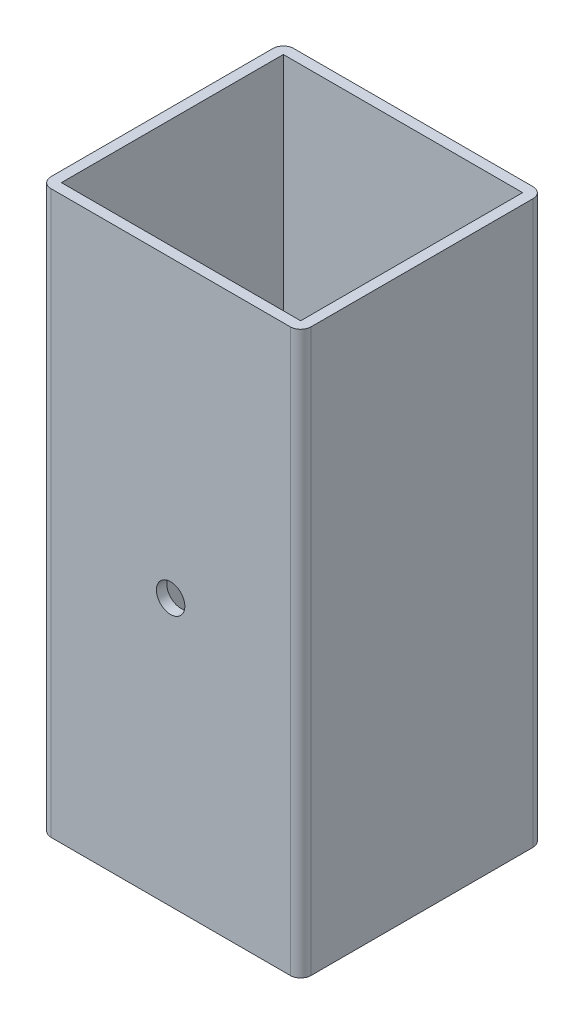
ISO-10303-21;
HEADER;
FILE_DESCRIPTION(('STEP AP214'),'2;1');
FILE_NAME('part.step','',(''),(''),'','','');
FILE_SCHEMA(('AUTOMOTIVE_DESIGN { 1 0 10303 214 1 1 1 1 }'));
ENDSEC;
DATA;
#1=APPLICATION_CONTEXT('core data for automotive mechanical design processes');
#2=APPLICATION_PROTOCOL_DEFINITION('international standard','automotive_design',2000,#1);
#3=PRODUCT_CONTEXT('',#1,'mechanical');
#4=PRODUCT('Part','Part','',(#3));
#5=PRODUCT_RELATED_PRODUCT_CATEGORY('part','',(#4));
#6=PRODUCT_DEFINITION_FORMATION('','',#4);
#7=PRODUCT_DEFINITION_CONTEXT('part definition',#1,'design');
#8=PRODUCT_DEFINITION('design','',#6,#7);
#9=PRODUCT_DEFINITION_SHAPE('','',#8);
#10=(LENGTH_UNIT() NAMED_UNIT(*) SI_UNIT(.MILLI.,.METRE.));
#11=(NAMED_UNIT(*) PLANE_ANGLE_UNIT() SI_UNIT($,.RADIAN.));
#12=(NAMED_UNIT(*) SI_UNIT($,.STERADIAN.) SOLID_ANGLE_UNIT());
#13=UNCERTAINTY_MEASURE_WITH_UNIT(LENGTH_MEASURE(1.E-05),#10,'distance_accuracy_value','');
#14=(GEOMETRIC_REPRESENTATION_CONTEXT(3) GLOBAL_UNCERTAINTY_ASSIGNED_CONTEXT((#13)) GLOBAL_UNIT_ASSIGNED_CONTEXT((#10,
#11,#12)) REPRESENTATION_CONTEXT('',''));
#15=CARTESIAN_POINT('',(0.,0.,0.));
#16=DIRECTION('',(0.,0.,1.));
#17=DIRECTION('',(1.,0.,0.));
#18=AXIS2_PLACEMENT_3D('',#15,#16,#17);
#19=CARTESIAN_POINT('',(75.,162.,70.));
#20=DIRECTION('',(0.,-1.,0.));
#21=DIRECTION('',(0.,0.,-1.));
#22=AXIS2_PLACEMENT_3D('',#19,#20,#21);
#23=PLANE('',#22);
#24=DIRECTION('',(-1.,0.,0.));
#25=VECTOR('',#24,1.);
#26=CARTESIAN_POINT('',(75.,162.,0.));
#27=LINE('',#26,#25);
#28=CARTESIAN_POINT('',(72.,162.,0.));
#29=VERTEX_POINT('',#28);
#30=CARTESIAN_POINT('',(3.,162.,0.));
#31=VERTEX_POINT('',#30);
#32=EDGE_CURVE('E172',#29,#31,#27,.T.);
#33=ORIENTED_EDGE('',*,*,#32,.T.);
#34=CARTESIAN_POINT('',(3.,162.,3.));
#35=DIRECTION('',(0.,-1.,0.));
#36=DIRECTION('',(0.,0.,-1.));
#37=AXIS2_PLACEMENT_3D('',#34,#35,#36);
#38=CIRCLE('',#37,3.);
#39=CARTESIAN_POINT('',(0.,162.,3.));
#40=VERTEX_POINT('',#39);
#41=EDGE_CURVE('E213',#31,#40,#38,.F.);
#42=ORIENTED_EDGE('',*,*,#41,.T.);
#43=DIRECTION('',(0.,0.,-1.));
#44=VECTOR('',#43,1.);
#45=CARTESIAN_POINT('',(0.,162.,70.));
#46=LINE('',#45,#44);
#47=CARTESIAN_POINT('',(0.,162.,67.));
#48=VERTEX_POINT('',#47);
#49=EDGE_CURVE('E175',#48,#40,#46,.T.);
#50=ORIENTED_EDGE('',*,*,#49,.F.);
#51=CARTESIAN_POINT('',(3.,162.,67.));
#52=DIRECTION('',(0.,-1.,0.));
#53=DIRECTION('',(0.,0.,-1.));
#54=AXIS2_PLACEMENT_3D('',#51,#52,#53);
#55=CIRCLE('',#54,3.);
#56=CARTESIAN_POINT('',(3.,162.,70.));
#57=VERTEX_POINT('',#56);
#58=EDGE_CURVE('E210',#48,#57,#55,.F.);
#59=ORIENTED_EDGE('',*,*,#58,.T.);
#60=DIRECTION('',(-1.,0.,0.));
#61=VECTOR('',#60,1.);
#62=CARTESIAN_POINT('',(75.,162.,70.));
#63=LINE('',#62,#61);
#64=CARTESIAN_POINT('',(72.,162.,70.));
#65=VERTEX_POINT('',#64);
#66=EDGE_CURVE('E171',#65,#57,#63,.T.);
#67=ORIENTED_EDGE('',*,*,#66,.F.);
#68=CARTESIAN_POINT('',(72.,162.,67.));
#69=DIRECTION('',(0.,-1.,0.));
#70=DIRECTION('',(0.,0.,-1.));
#71=AXIS2_PLACEMENT_3D('',#68,#69,#70);
#72=CIRCLE('',#71,3.);
#73=CARTESIAN_POINT('',(75.,162.,67.));
#74=VERTEX_POINT('',#73);
#75=EDGE_CURVE('E208',#65,#74,#72,.F.);
#76=ORIENTED_EDGE('',*,*,#75,.T.);
#77=DIRECTION('',(0.,0.,-1.));
#78=VECTOR('',#77,1.);
#79=CARTESIAN_POINT('',(75.,162.,70.));
#80=LINE('',#79,#78);
#81=CARTESIAN_POINT('',(75.,162.,3.));
#82=VERTEX_POINT('',#81);
#83=EDGE_CURVE('E182',#74,#82,#80,.T.);
#84=ORIENTED_EDGE('',*,*,#83,.T.);
#85=CARTESIAN_POINT('',(72.,162.,3.));
#86=DIRECTION('',(0.,-1.,0.));
#87=DIRECTION('',(0.,0.,-1.));
#88=AXIS2_PLACEMENT_3D('',#85,#86,#87);
#89=CIRCLE('',#88,3.);
#90=EDGE_CURVE('E63',#82,#29,#89,.F.);
#91=ORIENTED_EDGE('',*,*,#90,.T.);
#92=EDGE_LOOP('',(#33,#42,#50,#59,#67,#76,#84,#91));
#93=FACE_BOUND('',#92,.T.);
#94=DIRECTION('',(-1.,0.,0.));
#95=VECTOR('',#94,1.);
#96=CARTESIAN_POINT('',(75.,162.,3.));
#97=LINE('',#96,#95);
#98=CARTESIAN_POINT('',(72.,162.,3.));
#99=VERTEX_POINT('',#98);
#100=CARTESIAN_POINT('',(3.,162.,3.));
#101=VERTEX_POINT('',#100);
#102=EDGE_CURVE('E151',#99,#101,#97,.T.);
#103=ORIENTED_EDGE('',*,*,#102,.F.);
#104=DIRECTION('',(0.,0.,-1.));
#105=VECTOR('',#104,1.);
#106=CARTESIAN_POINT('',(72.,162.,70.));
#107=LINE('',#106,#105);
#108=CARTESIAN_POINT('',(72.,162.,67.));
#109=VERTEX_POINT('',#108);
#110=EDGE_CURVE('E164',#109,#99,#107,.T.);
#111=ORIENTED_EDGE('',*,*,#110,.F.);
#112=DIRECTION('',(-1.,0.,0.));
#113=VECTOR('',#112,1.);
#114=CARTESIAN_POINT('',(75.,162.,67.));
#115=LINE('',#114,#113);
#116=CARTESIAN_POINT('',(3.,162.,67.));
#117=VERTEX_POINT('',#116);
#118=EDGE_CURVE('E55',#109,#117,#115,.T.);
#119=ORIENTED_EDGE('',*,*,#118,.T.);
#120=DIRECTION('',(0.,0.,-1.));
#121=VECTOR('',#120,1.);
#122=CARTESIAN_POINT('',(3.,162.,70.));
#123=LINE('',#122,#121);
#124=EDGE_CURVE('E145',#117,#101,#123,.T.);
#125=ORIENTED_EDGE('',*,*,#124,.T.);
#126=EDGE_LOOP('',(#103,#111,#119,#125));
#127=FACE_BOUND('',#126,.T.);
#128=ADVANCED_FACE('F39',(#93,#127),#23,.F.);
#129=CARTESIAN_POINT('',(0.,162.,70.));
#130=DIRECTION('',(1.,0.,0.));
#131=DIRECTION('',(0.,0.,-1.));
#132=AXIS2_PLACEMENT_3D('',#129,#130,#131);
#133=PLANE('',#132);
#134=ORIENTED_EDGE('',*,*,#49,.T.);
#135=DIRECTION('',(0.,-1.,0.));
#136=VECTOR('',#135,1.);
#137=CARTESIAN_POINT('',(0.,162.,3.));
#138=LINE('',#137,#136);
#139=CARTESIAN_POINT('',(0.,0.,3.));
#140=VERTEX_POINT('',#139);
#141=EDGE_CURVE('E193',#40,#140,#138,.T.);
#142=ORIENTED_EDGE('',*,*,#141,.T.);
#143=DIRECTION('',(0.,0.,-1.));
#144=VECTOR('',#143,1.);
#145=CARTESIAN_POINT('',(0.,0.,70.));
#146=LINE('',#145,#144);
#147=CARTESIAN_POINT('',(0.,0.,67.));
#148=VERTEX_POINT('',#147);
#149=EDGE_CURVE('E188',#148,#140,#146,.T.);
#150=ORIENTED_EDGE('',*,*,#149,.F.);
#151=DIRECTION('',(0.,-1.,0.));
#152=VECTOR('',#151,1.);
#153=CARTESIAN_POINT('',(0.,162.,67.));
#154=LINE('',#153,#152);
#155=EDGE_CURVE('E191',#148,#48,#154,.F.);
#156=ORIENTED_EDGE('',*,*,#155,.T.);
#157=EDGE_LOOP('',(#134,#142,#150,#156));
#158=FACE_BOUND('',#157,.T.);
#159=ADVANCED_FACE('F255',(#158),#133,.F.);
#160=CARTESIAN_POINT('',(0.,0.,70.));
#161=DIRECTION('',(0.,1.,0.));
#162=DIRECTION('',(0.,0.,1.));
#163=AXIS2_PLACEMENT_3D('',#160,#161,#162);
#164=PLANE('',#163);
#165=ORIENTED_EDGE('',*,*,#149,.T.);
#166=CARTESIAN_POINT('',(3.,0.,3.));
#167=DIRECTION('',(0.,1.,0.));
#168=DIRECTION('',(0.,0.,1.));
#169=AXIS2_PLACEMENT_3D('',#166,#167,#168);
#170=CIRCLE('',#169,3.);
#171=CARTESIAN_POINT('',(3.,0.,0.));
#172=VERTEX_POINT('',#171);
#173=EDGE_CURVE('E202',#140,#172,#170,.F.);
#174=ORIENTED_EDGE('',*,*,#173,.T.);
#175=DIRECTION('',(1.,0.,0.));
#176=VECTOR('',#175,1.);
#177=CARTESIAN_POINT('',(0.,0.,0.));
#178=LINE('',#177,#176);
#179=CARTESIAN_POINT('',(72.,0.,0.));
#180=VERTEX_POINT('',#179);
#181=EDGE_CURVE('E163',#172,#180,#178,.T.);
#182=ORIENTED_EDGE('',*,*,#181,.T.);
#183=CARTESIAN_POINT('',(72.,0.,3.));
#184=DIRECTION('',(0.,1.,0.));
#185=DIRECTION('',(0.,0.,1.));
#186=AXIS2_PLACEMENT_3D('',#183,#184,#185);
#187=CIRCLE('',#186,3.);
#188=CARTESIAN_POINT('',(75.,0.,3.));
#189=VERTEX_POINT('',#188);
#190=EDGE_CURVE('E200',#180,#189,#187,.F.);
#191=ORIENTED_EDGE('',*,*,#190,.T.);
#192=DIRECTION('',(0.,0.,-1.));
#193=VECTOR('',#192,1.);
#194=CARTESIAN_POINT('',(75.,0.,70.));
#195=LINE('',#194,#193);
#196=CARTESIAN_POINT('',(75.,0.,67.));
#197=VERTEX_POINT('',#196);
#198=EDGE_CURVE('E185',#197,#189,#195,.T.);
#199=ORIENTED_EDGE('',*,*,#198,.F.);
#200=CARTESIAN_POINT('',(72.,0.,67.));
#201=DIRECTION('',(0.,1.,0.));
#202=DIRECTION('',(0.,0.,1.));
#203=AXIS2_PLACEMENT_3D('',#200,#201,#202);
#204=CIRCLE('',#203,3.);
#205=CARTESIAN_POINT('',(72.,0.,70.));
#206=VERTEX_POINT('',#205);
#207=EDGE_CURVE('E196',#197,#206,#204,.F.);
#208=ORIENTED_EDGE('',*,*,#207,.T.);
#209=DIRECTION('',(1.,0.,0.));
#210=VECTOR('',#209,1.);
#211=CARTESIAN_POINT('',(0.,0.,70.));
#212=LINE('',#211,#210);
#213=CARTESIAN_POINT('',(3.,0.,70.));
#214=VERTEX_POINT('',#213);
#215=EDGE_CURVE('E168',#214,#206,#212,.T.);
#216=ORIENTED_EDGE('',*,*,#215,.F.);
#217=CARTESIAN_POINT('',(3.,0.,67.));
#218=DIRECTION('',(0.,1.,0.));
#219=DIRECTION('',(0.,0.,1.));
#220=AXIS2_PLACEMENT_3D('',#217,#218,#219);
#221=CIRCLE('',#220,3.);
#222=EDGE_CURVE('E198',#214,#148,#221,.F.);
#223=ORIENTED_EDGE('',*,*,#222,.T.);
#224=EDGE_LOOP('',(#165,#174,#182,#191,#199,#208,#216,#223));
#225=FACE_BOUND('',#224,.T.);
#226=ADVANCED_FACE('F237',(#225),#164,.F.);
#227=CARTESIAN_POINT('',(75.,0.,70.));
#228=DIRECTION('',(-1.,0.,0.));
#229=DIRECTION('',(0.,0.,1.));
#230=AXIS2_PLACEMENT_3D('',#227,#228,#229);
#231=PLANE('',#230);
#232=ORIENTED_EDGE('',*,*,#198,.T.);
#233=DIRECTION('',(0.,1.,0.));
#234=VECTOR('',#233,1.);
#235=CARTESIAN_POINT('',(75.,0.,3.));
#236=LINE('',#235,#234);
#237=EDGE_CURVE('E217',#189,#82,#236,.T.);
#238=ORIENTED_EDGE('',*,*,#237,.T.);
#239=ORIENTED_EDGE('',*,*,#83,.F.);
#240=DIRECTION('',(0.,1.,0.));
#241=VECTOR('',#240,1.);
#242=CARTESIAN_POINT('',(75.,0.,67.));
#243=LINE('',#242,#241);
#244=EDGE_CURVE('E215',#74,#197,#243,.F.);
#245=ORIENTED_EDGE('',*,*,#244,.T.);
#246=EDGE_LOOP('',(#232,#238,#239,#245));
#247=FACE_BOUND('',#246,.T.);
#248=ADVANCED_FACE('F242',(#247),#231,.F.);
#249=CARTESIAN_POINT('',(0.,0.,70.));
#250=DIRECTION('',(0.,0.,1.));
#251=DIRECTION('',(1.,0.,0.));
#252=AXIS2_PLACEMENT_3D('',#249,#250,#251);
#253=PLANE('',#252);
#254=CARTESIAN_POINT('',(37.5,77.,70.));
#255=DIRECTION('',(0.,0.,-1.));
#256=DIRECTION('',(-1.,0.,0.));
#257=AXIS2_PLACEMENT_3D('',#254,#255,#256);
#258=CIRCLE('',#257,4.1);
#259=CARTESIAN_POINT('',(33.4,77.,70.));
#260=VERTEX_POINT('',#259);
#261=EDGE_CURVE('E404',#260,#260,#258,.T.);
#262=ORIENTED_EDGE('',*,*,#261,.T.);
#263=EDGE_LOOP('',(#262));
#264=FACE_BOUND('',#263,.T.);
#265=ORIENTED_EDGE('',*,*,#66,.T.);
#266=DIRECTION('',(0.,-1.,0.));
#267=VECTOR('',#266,1.);
#268=CARTESIAN_POINT('',(3.,0.,70.));
#269=LINE('',#268,#267);
#270=EDGE_CURVE('E11',#57,#214,#269,.T.);
#271=ORIENTED_EDGE('',*,*,#270,.T.);
#272=ORIENTED_EDGE('',*,*,#215,.T.);
#273=DIRECTION('',(0.,1.,0.));
#274=VECTOR('',#273,1.);
#275=CARTESIAN_POINT('',(72.,162.,70.));
#276=LINE('',#275,#274);
#277=EDGE_CURVE('E48',#206,#65,#276,.T.);
#278=ORIENTED_EDGE('',*,*,#277,.T.);
#279=EDGE_LOOP('',(#265,#271,#272,#278));
#280=FACE_BOUND('',#279,.T.);
#281=ADVANCED_FACE('F223',(#264,#280),#253,.T.);
#282=CARTESIAN_POINT('',(0.,0.,0.));
#283=DIRECTION('',(0.,0.,1.));
#284=DIRECTION('',(1.,0.,0.));
#285=AXIS2_PLACEMENT_3D('',#282,#283,#284);
#286=PLANE('',#285);
#287=CARTESIAN_POINT('',(37.5,77.,0.));
#288=DIRECTION('',(0.,0.,-1.));
#289=DIRECTION('',(-1.,0.,0.));
#290=AXIS2_PLACEMENT_3D('',#287,#288,#289);
#291=CIRCLE('',#290,4.1);
#292=CARTESIAN_POINT('',(33.4,77.,0.));
#293=VERTEX_POINT('',#292);
#294=EDGE_CURVE('E412',#293,#293,#291,.T.);
#295=ORIENTED_EDGE('',*,*,#294,.F.);
#296=EDGE_LOOP('',(#295));
#297=FACE_BOUND('',#296,.T.);
#298=ORIENTED_EDGE('',*,*,#181,.F.);
#299=DIRECTION('',(0.,-1.,0.));
#300=VECTOR('',#299,1.);
#301=CARTESIAN_POINT('',(3.,0.,0.));
#302=LINE('',#301,#300);
#303=EDGE_CURVE('E206',#172,#31,#302,.F.);
#304=ORIENTED_EDGE('',*,*,#303,.T.);
#305=ORIENTED_EDGE('',*,*,#32,.F.);
#306=DIRECTION('',(0.,1.,0.));
#307=VECTOR('',#306,1.);
#308=CARTESIAN_POINT('',(72.,0.,0.));
#309=LINE('',#308,#307);
#310=EDGE_CURVE('E204',#29,#180,#309,.F.);
#311=ORIENTED_EDGE('',*,*,#310,.T.);
#312=EDGE_LOOP('',(#298,#304,#305,#311));
#313=FACE_BOUND('',#312,.T.);
#314=ADVANCED_FACE('F247',(#297,#313),#286,.F.);
#315=CARTESIAN_POINT('',(3.,162.,3.));
#316=DIRECTION('',(0.,-1.,0.));
#317=DIRECTION('',(0.,0.,-1.));
#318=AXIS2_PLACEMENT_3D('',#315,#316,#317);
#319=CYLINDRICAL_SURFACE('',#318,3.);
#320=ORIENTED_EDGE('',*,*,#41,.F.);
#321=ORIENTED_EDGE('',*,*,#303,.F.);
#322=ORIENTED_EDGE('',*,*,#173,.F.);
#323=ORIENTED_EDGE('',*,*,#141,.F.);
#324=EDGE_LOOP('',(#320,#321,#322,#323));
#325=FACE_BOUND('',#324,.T.);
#326=ADVANCED_FACE('F252',(#325),#319,.T.);
#327=CARTESIAN_POINT('',(72.,0.,3.));
#328=DIRECTION('',(0.,1.,0.));
#329=DIRECTION('',(0.,0.,1.));
#330=AXIS2_PLACEMENT_3D('',#327,#328,#329);
#331=CYLINDRICAL_SURFACE('',#330,3.);
#332=ORIENTED_EDGE('',*,*,#190,.F.);
#333=ORIENTED_EDGE('',*,*,#310,.F.);
#334=ORIENTED_EDGE('',*,*,#90,.F.);
#335=ORIENTED_EDGE('',*,*,#237,.F.);
#336=EDGE_LOOP('',(#332,#333,#334,#335));
#337=FACE_BOUND('',#336,.T.);
#338=ADVANCED_FACE('F250',(#337),#331,.T.);
#339=CARTESIAN_POINT('',(3.,0.,67.));
#340=DIRECTION('',(0.,1.,0.));
#341=DIRECTION('',(0.,0.,1.));
#342=AXIS2_PLACEMENT_3D('',#339,#340,#341);
#343=CYLINDRICAL_SURFACE('',#342,3.);
#344=ORIENTED_EDGE('',*,*,#58,.F.);
#345=ORIENTED_EDGE('',*,*,#155,.F.);
#346=ORIENTED_EDGE('',*,*,#222,.F.);
#347=ORIENTED_EDGE('',*,*,#270,.F.);
#348=EDGE_LOOP('',(#344,#345,#346,#347));
#349=FACE_BOUND('',#348,.T.);
#350=ADVANCED_FACE('F235',(#349),#343,.T.);
#351=CARTESIAN_POINT('',(72.,0.,67.));
#352=DIRECTION('',(0.,-1.,0.));
#353=DIRECTION('',(0.,0.,-1.));
#354=AXIS2_PLACEMENT_3D('',#351,#352,#353);
#355=CYLINDRICAL_SURFACE('',#354,3.);
#356=ORIENTED_EDGE('',*,*,#207,.F.);
#357=ORIENTED_EDGE('',*,*,#244,.F.);
#358=ORIENTED_EDGE('',*,*,#75,.F.);
#359=ORIENTED_EDGE('',*,*,#277,.F.);
#360=EDGE_LOOP('',(#356,#357,#358,#359));
#361=FACE_BOUND('',#360,.T.);
#362=ADVANCED_FACE('F41',(#361),#355,.T.);
#363=CARTESIAN_POINT('',(3.,162.,70.));
#364=DIRECTION('',(1.,0.,0.));
#365=DIRECTION('',(0.,0.,-1.));
#366=AXIS2_PLACEMENT_3D('',#363,#364,#365);
#367=PLANE('',#366);
#368=ORIENTED_EDGE('',*,*,#124,.F.);
#369=DIRECTION('',(0.,1.,0.));
#370=VECTOR('',#369,1.);
#371=CARTESIAN_POINT('',(3.,0.,67.));
#372=LINE('',#371,#370);
#373=CARTESIAN_POINT('',(3.,3.,67.));
#374=VERTEX_POINT('',#373);
#375=EDGE_CURVE('E139',#374,#117,#372,.T.);
#376=ORIENTED_EDGE('',*,*,#375,.F.);
#377=DIRECTION('',(0.,0.,-1.));
#378=VECTOR('',#377,1.);
#379=CARTESIAN_POINT('',(3.,3.,70.));
#380=LINE('',#379,#378);
#381=CARTESIAN_POINT('',(3.,3.,3.));
#382=VERTEX_POINT('',#381);
#383=EDGE_CURVE('E130',#374,#382,#380,.T.);
#384=ORIENTED_EDGE('',*,*,#383,.T.);
#385=DIRECTION('',(0.,1.,0.));
#386=VECTOR('',#385,1.);
#387=CARTESIAN_POINT('',(3.,0.,3.));
#388=LINE('',#387,#386);
#389=EDGE_CURVE('E161',#382,#101,#388,.T.);
#390=ORIENTED_EDGE('',*,*,#389,.T.);
#391=EDGE_LOOP('',(#368,#376,#384,#390));
#392=FACE_BOUND('',#391,.T.);
#393=ADVANCED_FACE('F143',(#392),#367,.T.);
#394=CARTESIAN_POINT('',(0.,3.,70.));
#395=DIRECTION('',(0.,1.,0.));
#396=DIRECTION('',(0.,0.,1.));
#397=AXIS2_PLACEMENT_3D('',#394,#395,#396);
#398=PLANE('',#397);
#399=ORIENTED_EDGE('',*,*,#383,.F.);
#400=DIRECTION('',(1.,0.,0.));
#401=VECTOR('',#400,1.);
#402=CARTESIAN_POINT('',(0.,3.,67.));
#403=LINE('',#402,#401);
#404=CARTESIAN_POINT('',(72.,3.,67.));
#405=VERTEX_POINT('',#404);
#406=EDGE_CURVE('E134',#374,#405,#403,.T.);
#407=ORIENTED_EDGE('',*,*,#406,.T.);
#408=DIRECTION('',(0.,0.,-1.));
#409=VECTOR('',#408,1.);
#410=CARTESIAN_POINT('',(72.,3.,70.));
#411=LINE('',#410,#409);
#412=CARTESIAN_POINT('',(72.,3.,3.));
#413=VERTEX_POINT('',#412);
#414=EDGE_CURVE('E140',#405,#413,#411,.T.);
#415=ORIENTED_EDGE('',*,*,#414,.T.);
#416=DIRECTION('',(1.,0.,0.));
#417=VECTOR('',#416,1.);
#418=CARTESIAN_POINT('',(0.,3.,3.));
#419=LINE('',#418,#417);
#420=EDGE_CURVE('E136',#382,#413,#419,.T.);
#421=ORIENTED_EDGE('',*,*,#420,.F.);
#422=EDGE_LOOP('',(#399,#407,#415,#421));
#423=FACE_BOUND('',#422,.T.);
#424=ADVANCED_FACE('F132',(#423),#398,.T.);
#425=CARTESIAN_POINT('',(72.,0.,70.));
#426=DIRECTION('',(-1.,0.,0.));
#427=DIRECTION('',(0.,0.,1.));
#428=AXIS2_PLACEMENT_3D('',#425,#426,#427);
#429=PLANE('',#428);
#430=ORIENTED_EDGE('',*,*,#414,.F.);
#431=DIRECTION('',(0.,-1.,0.));
#432=VECTOR('',#431,1.);
#433=CARTESIAN_POINT('',(72.,0.,67.));
#434=LINE('',#433,#432);
#435=EDGE_CURVE('E149',#109,#405,#434,.T.);
#436=ORIENTED_EDGE('',*,*,#435,.F.);
#437=ORIENTED_EDGE('',*,*,#110,.T.);
#438=DIRECTION('',(0.,-1.,0.));
#439=VECTOR('',#438,1.);
#440=CARTESIAN_POINT('',(72.,0.,3.));
#441=LINE('',#440,#439);
#442=EDGE_CURVE('E146',#99,#413,#441,.T.);
#443=ORIENTED_EDGE('',*,*,#442,.T.);
#444=EDGE_LOOP('',(#430,#436,#437,#443));
#445=FACE_BOUND('',#444,.T.);
#446=ADVANCED_FACE('F280',(#445),#429,.T.);
#447=CARTESIAN_POINT('',(0.,0.,67.));
#448=DIRECTION('',(0.,0.,1.));
#449=DIRECTION('',(1.,0.,0.));
#450=AXIS2_PLACEMENT_3D('',#447,#448,#449);
#451=PLANE('',#450);
#452=CARTESIAN_POINT('',(37.5,77.,67.));
#453=DIRECTION('',(0.,0.,1.));
#454=DIRECTION('',(1.,0.,0.));
#455=AXIS2_PLACEMENT_3D('',#452,#453,#454);
#456=CIRCLE('',#455,4.1);
#457=CARTESIAN_POINT('',(41.6,77.,67.));
#458=VERTEX_POINT('',#457);
#459=EDGE_CURVE('E407',#458,#458,#456,.T.);
#460=ORIENTED_EDGE('',*,*,#459,.T.);
#461=EDGE_LOOP('',(#460));
#462=FACE_BOUND('',#461,.T.);
#463=ORIENTED_EDGE('',*,*,#118,.F.);
#464=ORIENTED_EDGE('',*,*,#435,.T.);
#465=ORIENTED_EDGE('',*,*,#406,.F.);
#466=ORIENTED_EDGE('',*,*,#375,.T.);
#467=EDGE_LOOP('',(#463,#464,#465,#466));
#468=FACE_BOUND('',#467,.T.);
#469=ADVANCED_FACE('F148',(#462,#468),#451,.F.);
#470=CARTESIAN_POINT('',(0.,0.,3.));
#471=DIRECTION('',(0.,0.,1.));
#472=DIRECTION('',(1.,0.,0.));
#473=AXIS2_PLACEMENT_3D('',#470,#471,#472);
#474=PLANE('',#473);
#475=CARTESIAN_POINT('',(37.5,77.,3.));
#476=DIRECTION('',(0.,0.,1.));
#477=DIRECTION('',(1.,0.,0.));
#478=AXIS2_PLACEMENT_3D('',#475,#476,#477);
#479=CIRCLE('',#478,4.1);
#480=CARTESIAN_POINT('',(41.6,77.,3.));
#481=VERTEX_POINT('',#480);
#482=EDGE_CURVE('E43',#481,#481,#479,.T.);
#483=ORIENTED_EDGE('',*,*,#482,.F.);
#484=EDGE_LOOP('',(#483));
#485=FACE_BOUND('',#484,.T.);
#486=ORIENTED_EDGE('',*,*,#420,.T.);
#487=ORIENTED_EDGE('',*,*,#442,.F.);
#488=ORIENTED_EDGE('',*,*,#102,.T.);
#489=ORIENTED_EDGE('',*,*,#389,.F.);
#490=EDGE_LOOP('',(#486,#487,#488,#489));
#491=FACE_BOUND('',#490,.T.);
#492=ADVANCED_FACE('F290',(#485,#491),#474,.T.);
#493=CARTESIAN_POINT('',(37.5,77.,70.));
#494=DIRECTION('',(0.,0.,-1.));
#495=DIRECTION('',(-1.,0.,0.));
#496=AXIS2_PLACEMENT_3D('',#493,#494,#495);
#497=CYLINDRICAL_SURFACE('',#496,4.1);
#498=ORIENTED_EDGE('',*,*,#482,.T.);
#499=EDGE_LOOP('',(#498));
#500=FACE_BOUND('',#499,.T.);
#501=ORIENTED_EDGE('',*,*,#294,.T.);
#502=EDGE_LOOP('',(#501));
#503=FACE_BOUND('',#502,.T.);
#504=ADVANCED_FACE('F283',(#500,#503),#497,.F.);
#505=ORIENTED_EDGE('',*,*,#261,.F.);
#506=EDGE_LOOP('',(#505));
#507=FACE_BOUND('',#506,.T.);
#508=ORIENTED_EDGE('',*,*,#459,.F.);
#509=EDGE_LOOP('',(#508));
#510=FACE_BOUND('',#509,.T.);
#511=ADVANCED_FACE('F373',(#507,#510),#497,.F.);
#512=CLOSED_SHELL('',(#128,#159,#226,#248,#281,#314,#326,#338,#350,#362,#393,#424,#446,#469,
#492,#504,#511));
#513=MANIFOLD_SOLID_BREP('B2',#512);
#514=ADVANCED_BREP_SHAPE_REPRESENTATION('',(#18,#513),#14);
#515=SHAPE_DEFINITION_REPRESENTATION(#9,#514);
ENDSEC;
END-ISO-10303-21;
